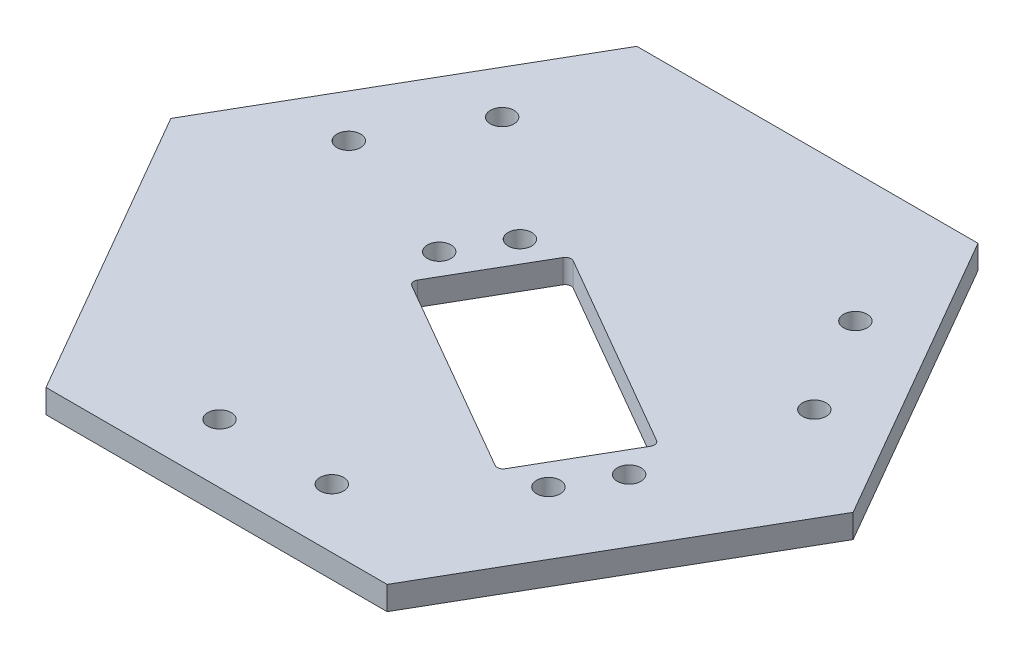
ISO-10303-21;
HEADER;
FILE_DESCRIPTION(('STEP AP214'),'2;1');
FILE_NAME('part.step','',(''),(''),'','','');
FILE_SCHEMA(('AUTOMOTIVE_DESIGN { 1 0 10303 214 1 1 1 1 }'));
ENDSEC;
DATA;
#1=APPLICATION_CONTEXT('core data for automotive mechanical design processes');
#2=APPLICATION_PROTOCOL_DEFINITION('international standard','automotive_design',2000,#1);
#3=PRODUCT_CONTEXT('',#1,'mechanical');
#4=PRODUCT('Part','Part','',(#3));
#5=PRODUCT_RELATED_PRODUCT_CATEGORY('part','',(#4));
#6=PRODUCT_DEFINITION_FORMATION('','',#4);
#7=PRODUCT_DEFINITION_CONTEXT('part definition',#1,'design');
#8=PRODUCT_DEFINITION('design','',#6,#7);
#9=PRODUCT_DEFINITION_SHAPE('','',#8);
#10=(LENGTH_UNIT() NAMED_UNIT(*) SI_UNIT(.MILLI.,.METRE.));
#11=(NAMED_UNIT(*) PLANE_ANGLE_UNIT() SI_UNIT($,.RADIAN.));
#12=(NAMED_UNIT(*) SI_UNIT($,.STERADIAN.) SOLID_ANGLE_UNIT());
#13=UNCERTAINTY_MEASURE_WITH_UNIT(LENGTH_MEASURE(1.E-05),#10,'distance_accuracy_value','');
#14=(GEOMETRIC_REPRESENTATION_CONTEXT(3) GLOBAL_UNCERTAINTY_ASSIGNED_CONTEXT((#13)) GLOBAL_UNIT_ASSIGNED_CONTEXT((#10,
#11,#12)) REPRESENTATION_CONTEXT('',''));
#15=CARTESIAN_POINT('',(0.,0.,0.));
#16=DIRECTION('',(0.,0.,1.));
#17=DIRECTION('',(1.,0.,0.));
#18=AXIS2_PLACEMENT_3D('',#15,#16,#17);
#19=CARTESIAN_POINT('',(-28.8675134594812,2.,50.));
#20=DIRECTION('',(0.,1.,0.));
#21=DIRECTION('',(0.,0.,1.));
#22=AXIS2_PLACEMENT_3D('',#19,#20,#21);
#23=PLANE('',#22);
#24=CARTESIAN_POINT('',(-15.4903810567666,2.,-3.16987298107772));
#25=DIRECTION('',(0.,1.,0.));
#26=DIRECTION('',(0.,0.,-1.));
#27=AXIS2_PLACEMENT_3D('',#24,#25,#26);
#28=CIRCLE('',#27,2.);
#29=CARTESIAN_POINT('',(-15.4903810567666,2.,-5.16987298107772));
#30=VERTEX_POINT('',#29);
#31=EDGE_CURVE('E193',#30,#30,#28,.T.);
#32=ORIENTED_EDGE('',*,*,#31,.F.);
#33=EDGE_LOOP('',(#32));
#34=FACE_BOUND('',#33,.T.);
#35=CARTESIAN_POINT('',(28.2439018343477,2.,22.080127018922));
#36=DIRECTION('',(0.,1.,0.));
#37=DIRECTION('',(0.,0.,-1.));
#38=AXIS2_PLACEMENT_3D('',#35,#36,#37);
#39=CIRCLE('',#38,2.);
#40=CARTESIAN_POINT('',(28.2439018343477,2.,20.080127018922));
#41=VERTEX_POINT('',#40);
#42=EDGE_CURVE('E189',#41,#41,#39,.T.);
#43=ORIENTED_EDGE('',*,*,#42,.F.);
#44=EDGE_LOOP('',(#43));
#45=FACE_BOUND('',#44,.T.);
#46=CARTESIAN_POINT('',(33.2439018343477,2.,13.4198729810776));
#47=DIRECTION('',(0.,1.,0.));
#48=DIRECTION('',(0.,0.,1.));
#49=AXIS2_PLACEMENT_3D('',#46,#47,#48);
#50=CIRCLE('',#49,2.);
#51=CARTESIAN_POINT('',(33.2439018343477,2.,15.4198729810776));
#52=VERTEX_POINT('',#51);
#53=EDGE_CURVE('E185',#52,#52,#50,.T.);
#54=ORIENTED_EDGE('',*,*,#53,.F.);
#55=EDGE_LOOP('',(#54));
#56=FACE_BOUND('',#55,.T.);
#57=CARTESIAN_POINT('',(-10.4903810567667,2.,-11.8301270189221));
#58=DIRECTION('',(0.,1.,0.));
#59=DIRECTION('',(0.,0.,1.));
#60=AXIS2_PLACEMENT_3D('',#57,#58,#59);
#61=CIRCLE('',#60,2.);
#62=CARTESIAN_POINT('',(-10.4903810567667,2.,-9.83012701892213));
#63=VERTEX_POINT('',#62);
#64=EDGE_CURVE('E181',#63,#63,#61,.T.);
#65=ORIENTED_EDGE('',*,*,#64,.F.);
#66=EDGE_LOOP('',(#65));
#67=FACE_BOUND('',#66,.T.);
#68=DIRECTION('',(0.866025403784442,0.,0.499999999999995));
#69=VECTOR('',#68,1.);
#70=CARTESIAN_POINT('',(-13.6602540378444,2.,3.66025403784447));
#71=LINE('',#70,#69);
#72=CARTESIAN_POINT('',(-12.7942286340599,2.,4.16025403784446));
#73=VERTEX_POINT('',#72);
#74=CARTESIAN_POINT('',(20.5477494116411,2.,23.4102540378443));
#75=VERTEX_POINT('',#74);
#76=EDGE_CURVE('E180',#73,#75,#71,.T.);
#77=ORIENTED_EDGE('',*,*,#76,.F.);
#78=CARTESIAN_POINT('',(-12.2942286340599,2.,3.29422863406002));
#79=DIRECTION('',(0.,1.,0.));
#80=DIRECTION('',(0.,0.,1.));
#81=AXIS2_PLACEMENT_3D('',#78,#79,#80);
#82=CIRCLE('',#81,1.);
#83=CARTESIAN_POINT('',(-13.1602540378444,2.,2.79422863406003));
#84=VERTEX_POINT('',#83);
#85=EDGE_CURVE('E216',#73,#84,#82,.F.);
#86=ORIENTED_EDGE('',*,*,#85,.T.);
#87=DIRECTION('',(-0.499999999999995,0.,0.866025403784442));
#88=VECTOR('',#87,1.);
#89=CARTESIAN_POINT('',(-13.6602540378444,2.,3.66025403784447));
#90=LINE('',#89,#88);
#91=CARTESIAN_POINT('',(-4.16025403784446,2.,-12.7942286340599));
#92=VERTEX_POINT('',#91);
#93=EDGE_CURVE('E229',#92,#84,#90,.T.);
#94=ORIENTED_EDGE('',*,*,#93,.F.);
#95=CARTESIAN_POINT('',(-3.29422863406002,2.,-12.2942286340599));
#96=DIRECTION('',(0.,1.,0.));
#97=DIRECTION('',(0.,0.,1.));
#98=AXIS2_PLACEMENT_3D('',#95,#96,#97);
#99=CIRCLE('',#98,1.);
#100=CARTESIAN_POINT('',(-2.79422863406003,2.,-13.1602540378444));
#101=VERTEX_POINT('',#100);
#102=EDGE_CURVE('E42',#92,#101,#99,.F.);
#103=ORIENTED_EDGE('',*,*,#102,.T.);
#104=DIRECTION('',(-0.866025403784442,0.,-0.499999999999995));
#105=VECTOR('',#104,1.);
#106=CARTESIAN_POINT('',(-3.66025403784447,2.,-13.6602540378444));
#107=LINE('',#106,#105);
#108=CARTESIAN_POINT('',(30.547749411641,2.,6.08974596215542));
#109=VERTEX_POINT('',#108);
#110=EDGE_CURVE('E227',#109,#101,#107,.T.);
#111=ORIENTED_EDGE('',*,*,#110,.F.);
#112=CARTESIAN_POINT('',(30.047749411641,2.,6.95577136593986));
#113=DIRECTION('',(0.,1.,0.));
#114=DIRECTION('',(0.,0.,1.));
#115=AXIS2_PLACEMENT_3D('',#112,#113,#114);
#116=CIRCLE('',#115,1.);
#117=CARTESIAN_POINT('',(30.9137748154254,2.,7.45577136593986));
#118=VERTEX_POINT('',#117);
#119=EDGE_CURVE('E220',#109,#118,#116,.F.);
#120=ORIENTED_EDGE('',*,*,#119,.T.);
#121=DIRECTION('',(0.499999999999995,0.,-0.866025403784441));
#122=VECTOR('',#121,1.);
#123=CARTESIAN_POINT('',(21.4137748154255,2.,23.9102540378443));
#124=LINE('',#123,#122);
#125=CARTESIAN_POINT('',(21.9137748154255,2.,23.0442286340598));
#126=VERTEX_POINT('',#125);
#127=EDGE_CURVE('E234',#126,#118,#124,.T.);
#128=ORIENTED_EDGE('',*,*,#127,.F.);
#129=CARTESIAN_POINT('',(21.0477494116411,2.,22.5442286340598));
#130=DIRECTION('',(0.,1.,0.));
#131=DIRECTION('',(0.,0.,1.));
#132=AXIS2_PLACEMENT_3D('',#129,#130,#131);
#133=CIRCLE('',#132,1.);
#134=EDGE_CURVE('E212',#126,#75,#133,.F.);
#135=ORIENTED_EDGE('',*,*,#134,.T.);
#136=EDGE_LOOP('',(#77,#86,#94,#103,#111,#120,#128,#135));
#137=FACE_BOUND('',#136,.T.);
#138=CARTESIAN_POINT('',(-39.3910161513776,2.,-11.7727586640479));
#139=DIRECTION('',(0.,1.,0.));
#140=DIRECTION('',(0.,0.,-1.));
#141=AXIS2_PLACEMENT_3D('',#138,#139,#140);
#142=CIRCLE('',#141,2.);
#143=CARTESIAN_POINT('',(-39.3910161513776,2.,-13.7727586640479));
#144=VERTEX_POINT('',#143);
#145=EDGE_CURVE('E276',#144,#144,#142,.T.);
#146=ORIENTED_EDGE('',*,*,#145,.F.);
#147=EDGE_LOOP('',(#146));
#148=FACE_BOUND('',#147,.T.);
#149=CARTESIAN_POINT('',(-9.49999999999999,2.,40.));
#150=DIRECTION('',(0.,1.,0.));
#151=DIRECTION('',(0.,0.,1.));
#152=AXIS2_PLACEMENT_3D('',#149,#150,#151);
#153=CIRCLE('',#152,2.);
#154=CARTESIAN_POINT('',(-9.49999999999999,2.,42.));
#155=VERTEX_POINT('',#154);
#156=EDGE_CURVE('E288',#155,#155,#153,.T.);
#157=ORIENTED_EDGE('',*,*,#156,.F.);
#158=EDGE_LOOP('',(#157));
#159=FACE_BOUND('',#158,.T.);
#160=CARTESIAN_POINT('',(29.8910161513776,2.,-28.2272413359522));
#161=DIRECTION('',(0.,1.,0.));
#162=DIRECTION('',(0.,0.,1.));
#163=AXIS2_PLACEMENT_3D('',#160,#161,#162);
#164=CIRCLE('',#163,2.);
#165=CARTESIAN_POINT('',(29.8910161513776,2.,-26.2272413359522));
#166=VERTEX_POINT('',#165);
#167=EDGE_CURVE('E300',#166,#166,#164,.T.);
#168=ORIENTED_EDGE('',*,*,#167,.F.);
#169=EDGE_LOOP('',(#168));
#170=FACE_BOUND('',#169,.T.);
#171=DIRECTION('',(0.500000000000002,0.,0.866025403784438));
#172=VECTOR('',#171,1.);
#173=CARTESIAN_POINT('',(-57.7350269189626,2.,0.));
#174=LINE('',#173,#172);
#175=CARTESIAN_POINT('',(-57.7350269189626,2.,0.));
#176=VERTEX_POINT('',#175);
#177=CARTESIAN_POINT('',(-28.8675134594812,2.,50.));
#178=VERTEX_POINT('',#177);
#179=EDGE_CURVE('E147',#176,#178,#174,.T.);
#180=ORIENTED_EDGE('',*,*,#179,.T.);
#181=DIRECTION('',(1.,0.,0.));
#182=VECTOR('',#181,1.);
#183=CARTESIAN_POINT('',(-28.8675134594812,2.,50.));
#184=LINE('',#183,#182);
#185=CARTESIAN_POINT('',(28.8675134594813,2.,50.));
#186=VERTEX_POINT('',#185);
#187=EDGE_CURVE('E136',#178,#186,#184,.T.);
#188=ORIENTED_EDGE('',*,*,#187,.T.);
#189=DIRECTION('',(0.5,0.,-0.866025403784438));
#190=VECTOR('',#189,1.);
#191=CARTESIAN_POINT('',(28.8675134594813,2.,50.));
#192=LINE('',#191,#190);
#193=CARTESIAN_POINT('',(57.7350269189626,2.,0.));
#194=VERTEX_POINT('',#193);
#195=EDGE_CURVE('E146',#186,#194,#192,.T.);
#196=ORIENTED_EDGE('',*,*,#195,.T.);
#197=DIRECTION('',(-0.5,0.,-0.866025403784438));
#198=VECTOR('',#197,1.);
#199=CARTESIAN_POINT('',(57.7350269189626,2.,0.));
#200=LINE('',#199,#198);
#201=CARTESIAN_POINT('',(28.8675134594813,2.,-50.));
#202=VERTEX_POINT('',#201);
#203=EDGE_CURVE('E306',#194,#202,#200,.T.);
#204=ORIENTED_EDGE('',*,*,#203,.T.);
#205=DIRECTION('',(-1.,0.,0.));
#206=VECTOR('',#205,1.);
#207=CARTESIAN_POINT('',(-28.8675134594813,2.,-50.));
#208=LINE('',#207,#206);
#209=CARTESIAN_POINT('',(-28.8675134594813,2.,-50.));
#210=VERTEX_POINT('',#209);
#211=EDGE_CURVE('E308',#202,#210,#208,.T.);
#212=ORIENTED_EDGE('',*,*,#211,.T.);
#213=DIRECTION('',(-0.5,0.,0.866025403784439));
#214=VECTOR('',#213,1.);
#215=CARTESIAN_POINT('',(-28.8675134594813,2.,-50.));
#216=LINE('',#215,#214);
#217=EDGE_CURVE('E152',#210,#176,#216,.T.);
#218=ORIENTED_EDGE('',*,*,#217,.T.);
#219=EDGE_LOOP('',(#180,#188,#196,#204,#212,#218));
#220=FACE_BOUND('',#219,.T.);
#221=CARTESIAN_POINT('',(39.3910161513776,2.,-11.7727586640479));
#222=DIRECTION('',(0.,1.,0.));
#223=DIRECTION('',(0.,0.,1.));
#224=AXIS2_PLACEMENT_3D('',#221,#222,#223);
#225=CIRCLE('',#224,2.);
#226=CARTESIAN_POINT('',(39.3910161513776,2.,-9.77275866404785));
#227=VERTEX_POINT('',#226);
#228=EDGE_CURVE('E294',#227,#227,#225,.T.);
#229=ORIENTED_EDGE('',*,*,#228,.F.);
#230=EDGE_LOOP('',(#229));
#231=FACE_BOUND('',#230,.T.);
#232=CARTESIAN_POINT('',(9.50000000000001,2.,40.));
#233=DIRECTION('',(0.,1.,0.));
#234=DIRECTION('',(0.,0.,1.));
#235=AXIS2_PLACEMENT_3D('',#232,#233,#234);
#236=CIRCLE('',#235,2.);
#237=CARTESIAN_POINT('',(9.50000000000001,2.,42.));
#238=VERTEX_POINT('',#237);
#239=EDGE_CURVE('E282',#238,#238,#236,.T.);
#240=ORIENTED_EDGE('',*,*,#239,.F.);
#241=EDGE_LOOP('',(#240));
#242=FACE_BOUND('',#241,.T.);
#243=CARTESIAN_POINT('',(-29.8910161513776,2.,-28.2272413359522));
#244=DIRECTION('',(0.,1.,0.));
#245=DIRECTION('',(0.,0.,-1.));
#246=AXIS2_PLACEMENT_3D('',#243,#244,#245);
#247=CIRCLE('',#246,2.);
#248=CARTESIAN_POINT('',(-29.8910161513776,2.,-30.2272413359522));
#249=VERTEX_POINT('',#248);
#250=EDGE_CURVE('E270',#249,#249,#247,.T.);
#251=ORIENTED_EDGE('',*,*,#250,.F.);
#252=EDGE_LOOP('',(#251));
#253=FACE_BOUND('',#252,.T.);
#254=ADVANCED_FACE('F34',(#34,#45,#56,#67,#137,#148,#159,#170,#220,#231,#242,#253),#23,.T.);
#255=CARTESIAN_POINT('',(-28.8675134594812,-2.,50.));
#256=DIRECTION('',(0.,1.,0.));
#257=DIRECTION('',(0.,0.,1.));
#258=AXIS2_PLACEMENT_3D('',#255,#256,#257);
#259=PLANE('',#258);
#260=CARTESIAN_POINT('',(-15.4903810567666,-2.,-3.16987298107772));
#261=DIRECTION('',(0.,1.,0.));
#262=DIRECTION('',(0.,0.,1.));
#263=AXIS2_PLACEMENT_3D('',#260,#261,#262);
#264=CIRCLE('',#263,2.);
#265=CARTESIAN_POINT('',(-15.4903810567666,-2.,-1.16987298107771));
#266=VERTEX_POINT('',#265);
#267=EDGE_CURVE('E190',#266,#266,#264,.T.);
#268=ORIENTED_EDGE('',*,*,#267,.T.);
#269=EDGE_LOOP('',(#268));
#270=FACE_BOUND('',#269,.T.);
#271=CARTESIAN_POINT('',(28.2439018343477,-2.,22.080127018922));
#272=DIRECTION('',(0.,1.,0.));
#273=DIRECTION('',(0.,0.,1.));
#274=AXIS2_PLACEMENT_3D('',#271,#272,#273);
#275=CIRCLE('',#274,2.);
#276=CARTESIAN_POINT('',(28.2439018343477,-2.,24.080127018922));
#277=VERTEX_POINT('',#276);
#278=EDGE_CURVE('E186',#277,#277,#275,.T.);
#279=ORIENTED_EDGE('',*,*,#278,.T.);
#280=EDGE_LOOP('',(#279));
#281=FACE_BOUND('',#280,.T.);
#282=CARTESIAN_POINT('',(33.2439018343477,-2.,13.4198729810776));
#283=DIRECTION('',(0.,1.,0.));
#284=DIRECTION('',(0.,0.,1.));
#285=AXIS2_PLACEMENT_3D('',#282,#283,#284);
#286=CIRCLE('',#285,2.);
#287=CARTESIAN_POINT('',(33.2439018343477,-2.,15.4198729810776));
#288=VERTEX_POINT('',#287);
#289=EDGE_CURVE('E182',#288,#288,#286,.T.);
#290=ORIENTED_EDGE('',*,*,#289,.T.);
#291=EDGE_LOOP('',(#290));
#292=FACE_BOUND('',#291,.T.);
#293=CARTESIAN_POINT('',(-10.4903810567667,-2.,-11.8301270189221));
#294=DIRECTION('',(0.,1.,0.));
#295=DIRECTION('',(0.,0.,1.));
#296=AXIS2_PLACEMENT_3D('',#293,#294,#295);
#297=CIRCLE('',#296,2.);
#298=CARTESIAN_POINT('',(-10.4903810567667,-2.,-9.83012701892213));
#299=VERTEX_POINT('',#298);
#300=EDGE_CURVE('E177',#299,#299,#297,.T.);
#301=ORIENTED_EDGE('',*,*,#300,.T.);
#302=EDGE_LOOP('',(#301));
#303=FACE_BOUND('',#302,.T.);
#304=DIRECTION('',(-0.866025403784442,0.,-0.499999999999995));
#305=VECTOR('',#304,1.);
#306=CARTESIAN_POINT('',(4.9999999999997,-2.,-8.66025403784457));
#307=LINE('',#306,#305);
#308=CARTESIAN_POINT('',(30.547749411641,-2.,6.08974596215542));
#309=VERTEX_POINT('',#308);
#310=CARTESIAN_POINT('',(-2.79422863406003,-2.,-13.1602540378444));
#311=VERTEX_POINT('',#310);
#312=EDGE_CURVE('E163',#309,#311,#307,.T.);
#313=ORIENTED_EDGE('',*,*,#312,.T.);
#314=CARTESIAN_POINT('',(-3.29422863406002,-2.,-12.2942286340599));
#315=DIRECTION('',(0.,1.,0.));
#316=DIRECTION('',(0.,0.,1.));
#317=AXIS2_PLACEMENT_3D('',#314,#315,#316);
#318=CIRCLE('',#317,1.);
#319=CARTESIAN_POINT('',(-4.16025403784446,-2.,-12.7942286340599));
#320=VERTEX_POINT('',#319);
#321=EDGE_CURVE('E11',#311,#320,#318,.T.);
#322=ORIENTED_EDGE('',*,*,#321,.T.);
#323=DIRECTION('',(-0.499999999999995,0.,0.866025403784442));
#324=VECTOR('',#323,1.);
#325=CARTESIAN_POINT('',(-37.5277674973254,-2.,45.0000000000002));
#326=LINE('',#325,#324);
#327=CARTESIAN_POINT('',(-13.1602540378444,-2.,2.79422863406002));
#328=VERTEX_POINT('',#327);
#329=EDGE_CURVE('E170',#320,#328,#326,.T.);
#330=ORIENTED_EDGE('',*,*,#329,.T.);
#331=CARTESIAN_POINT('',(-12.2942286340599,-2.,3.29422863406002));
#332=DIRECTION('',(0.,1.,0.));
#333=DIRECTION('',(0.,0.,1.));
#334=AXIS2_PLACEMENT_3D('',#331,#332,#333);
#335=CIRCLE('',#334,1.);
#336=CARTESIAN_POINT('',(-12.7942286340599,-2.,4.16025403784446));
#337=VERTEX_POINT('',#336);
#338=EDGE_CURVE('E218',#328,#337,#335,.T.);
#339=ORIENTED_EDGE('',*,*,#338,.T.);
#340=DIRECTION('',(0.866025403784442,0.,0.499999999999995));
#341=VECTOR('',#340,1.);
#342=CARTESIAN_POINT('',(-5.00000000000018,-2.,8.66025403784428));
#343=LINE('',#342,#341);
#344=CARTESIAN_POINT('',(20.5477494116411,-2.,23.4102540378443));
#345=VERTEX_POINT('',#344);
#346=EDGE_CURVE('E173',#337,#345,#343,.T.);
#347=ORIENTED_EDGE('',*,*,#346,.T.);
#348=CARTESIAN_POINT('',(21.0477494116411,-2.,22.5442286340598));
#349=DIRECTION('',(0.,1.,0.));
#350=DIRECTION('',(0.,0.,1.));
#351=AXIS2_PLACEMENT_3D('',#348,#349,#350);
#352=CIRCLE('',#351,1.);
#353=CARTESIAN_POINT('',(21.9137748154255,-2.,23.0442286340598));
#354=VERTEX_POINT('',#353);
#355=EDGE_CURVE('E214',#345,#354,#352,.T.);
#356=ORIENTED_EDGE('',*,*,#355,.T.);
#357=DIRECTION('',(0.499999999999995,0.,-0.866025403784442));
#358=VECTOR('',#357,1.);
#359=CARTESIAN_POINT('',(-2.45373864405551,-2.,65.25));
#360=LINE('',#359,#358);
#361=CARTESIAN_POINT('',(30.9137748154254,-2.,7.45577136593985));
#362=VERTEX_POINT('',#361);
#363=EDGE_CURVE('E161',#354,#362,#360,.T.);
#364=ORIENTED_EDGE('',*,*,#363,.T.);
#365=CARTESIAN_POINT('',(30.047749411641,-2.,6.95577136593986));
#366=DIRECTION('',(0.,1.,0.));
#367=DIRECTION('',(0.,0.,1.));
#368=AXIS2_PLACEMENT_3D('',#365,#366,#367);
#369=CIRCLE('',#368,1.);
#370=EDGE_CURVE('E56',#362,#309,#369,.T.);
#371=ORIENTED_EDGE('',*,*,#370,.T.);
#372=EDGE_LOOP('',(#313,#322,#330,#339,#347,#356,#364,#371));
#373=FACE_BOUND('',#372,.T.);
#374=CARTESIAN_POINT('',(-39.3910161513776,-2.,-11.7727586640479));
#375=DIRECTION('',(0.,1.,0.));
#376=DIRECTION('',(0.,0.,-1.));
#377=AXIS2_PLACEMENT_3D('',#374,#375,#376);
#378=CIRCLE('',#377,2.);
#379=CARTESIAN_POINT('',(-39.3910161513776,-2.,-13.7727586640479));
#380=VERTEX_POINT('',#379);
#381=EDGE_CURVE('E273',#380,#380,#378,.T.);
#382=ORIENTED_EDGE('',*,*,#381,.T.);
#383=EDGE_LOOP('',(#382));
#384=FACE_BOUND('',#383,.T.);
#385=CARTESIAN_POINT('',(-9.49999999999999,-2.,40.));
#386=DIRECTION('',(0.,1.,0.));
#387=DIRECTION('',(0.,0.,1.));
#388=AXIS2_PLACEMENT_3D('',#385,#386,#387);
#389=CIRCLE('',#388,2.);
#390=CARTESIAN_POINT('',(-9.49999999999999,-2.,42.));
#391=VERTEX_POINT('',#390);
#392=EDGE_CURVE('E285',#391,#391,#389,.T.);
#393=ORIENTED_EDGE('',*,*,#392,.T.);
#394=EDGE_LOOP('',(#393));
#395=FACE_BOUND('',#394,.T.);
#396=CARTESIAN_POINT('',(29.8910161513776,-2.,-28.2272413359522));
#397=DIRECTION('',(0.,1.,0.));
#398=DIRECTION('',(0.,0.,1.));
#399=AXIS2_PLACEMENT_3D('',#396,#397,#398);
#400=CIRCLE('',#399,2.);
#401=CARTESIAN_POINT('',(29.8910161513776,-2.,-26.2272413359522));
#402=VERTEX_POINT('',#401);
#403=EDGE_CURVE('E297',#402,#402,#400,.T.);
#404=ORIENTED_EDGE('',*,*,#403,.T.);
#405=EDGE_LOOP('',(#404));
#406=FACE_BOUND('',#405,.T.);
#407=DIRECTION('',(0.500000000000002,0.,0.866025403784438));
#408=VECTOR('',#407,1.);
#409=CARTESIAN_POINT('',(-57.7350269189626,-2.,0.));
#410=LINE('',#409,#408);
#411=CARTESIAN_POINT('',(-57.7350269189626,-2.,0.));
#412=VERTEX_POINT('',#411);
#413=CARTESIAN_POINT('',(-28.8675134594812,-2.,50.));
#414=VERTEX_POINT('',#413);
#415=EDGE_CURVE('E160',#412,#414,#410,.T.);
#416=ORIENTED_EDGE('',*,*,#415,.F.);
#417=DIRECTION('',(-0.5,0.,0.866025403784439));
#418=VECTOR('',#417,1.);
#419=CARTESIAN_POINT('',(-28.8675134594813,-2.,-50.));
#420=LINE('',#419,#418);
#421=CARTESIAN_POINT('',(-28.8675134594813,-2.,-50.));
#422=VERTEX_POINT('',#421);
#423=EDGE_CURVE('E156',#422,#412,#420,.T.);
#424=ORIENTED_EDGE('',*,*,#423,.F.);
#425=DIRECTION('',(-1.,0.,0.));
#426=VECTOR('',#425,1.);
#427=CARTESIAN_POINT('',(-28.8675134594813,-2.,-50.));
#428=LINE('',#427,#426);
#429=CARTESIAN_POINT('',(28.8675134594813,-2.,-50.));
#430=VERTEX_POINT('',#429);
#431=EDGE_CURVE('E319',#430,#422,#428,.T.);
#432=ORIENTED_EDGE('',*,*,#431,.F.);
#433=DIRECTION('',(-0.5,0.,-0.866025403784438));
#434=VECTOR('',#433,1.);
#435=CARTESIAN_POINT('',(57.7350269189626,-2.,0.));
#436=LINE('',#435,#434);
#437=CARTESIAN_POINT('',(57.7350269189626,-2.,0.));
#438=VERTEX_POINT('',#437);
#439=EDGE_CURVE('E317',#438,#430,#436,.T.);
#440=ORIENTED_EDGE('',*,*,#439,.F.);
#441=DIRECTION('',(0.5,0.,-0.866025403784438));
#442=VECTOR('',#441,1.);
#443=CARTESIAN_POINT('',(28.8675134594813,-2.,50.));
#444=LINE('',#443,#442);
#445=CARTESIAN_POINT('',(28.8675134594813,-2.,50.));
#446=VERTEX_POINT('',#445);
#447=EDGE_CURVE('E315',#446,#438,#444,.T.);
#448=ORIENTED_EDGE('',*,*,#447,.F.);
#449=DIRECTION('',(1.,0.,0.));
#450=VECTOR('',#449,1.);
#451=CARTESIAN_POINT('',(-28.8675134594812,-2.,50.));
#452=LINE('',#451,#450);
#453=EDGE_CURVE('E313',#414,#446,#452,.T.);
#454=ORIENTED_EDGE('',*,*,#453,.F.);
#455=EDGE_LOOP('',(#416,#424,#432,#440,#448,#454));
#456=FACE_BOUND('',#455,.T.);
#457=CARTESIAN_POINT('',(39.3910161513776,-2.,-11.7727586640479));
#458=DIRECTION('',(0.,1.,0.));
#459=DIRECTION('',(0.,0.,1.));
#460=AXIS2_PLACEMENT_3D('',#457,#458,#459);
#461=CIRCLE('',#460,2.);
#462=CARTESIAN_POINT('',(39.3910161513776,-2.,-9.77275866404785));
#463=VERTEX_POINT('',#462);
#464=EDGE_CURVE('E291',#463,#463,#461,.T.);
#465=ORIENTED_EDGE('',*,*,#464,.T.);
#466=EDGE_LOOP('',(#465));
#467=FACE_BOUND('',#466,.T.);
#468=CARTESIAN_POINT('',(9.50000000000001,-2.,40.));
#469=DIRECTION('',(0.,1.,0.));
#470=DIRECTION('',(0.,0.,1.));
#471=AXIS2_PLACEMENT_3D('',#468,#469,#470);
#472=CIRCLE('',#471,2.);
#473=CARTESIAN_POINT('',(9.50000000000001,-2.,42.));
#474=VERTEX_POINT('',#473);
#475=EDGE_CURVE('E279',#474,#474,#472,.T.);
#476=ORIENTED_EDGE('',*,*,#475,.T.);
#477=EDGE_LOOP('',(#476));
#478=FACE_BOUND('',#477,.T.);
#479=CARTESIAN_POINT('',(-29.8910161513776,-2.,-28.2272413359522));
#480=DIRECTION('',(0.,1.,0.));
#481=DIRECTION('',(0.,0.,-1.));
#482=AXIS2_PLACEMENT_3D('',#479,#480,#481);
#483=CIRCLE('',#482,2.);
#484=CARTESIAN_POINT('',(-29.8910161513776,-2.,-30.2272413359522));
#485=VERTEX_POINT('',#484);
#486=EDGE_CURVE('E269',#485,#485,#483,.T.);
#487=ORIENTED_EDGE('',*,*,#486,.T.);
#488=EDGE_LOOP('',(#487));
#489=FACE_BOUND('',#488,.T.);
#490=ADVANCED_FACE('F238',(#270,#281,#292,#303,#373,#384,#395,#406,#456,#467,#478,#489),#259,.F.);
#491=CARTESIAN_POINT('',(-57.7350269189626,2.,0.));
#492=DIRECTION('',(0.866025403784438,0.,-0.500000000000002));
#493=DIRECTION('',(-0.500000000000002,0.,-0.866025403784438));
#494=AXIS2_PLACEMENT_3D('',#491,#492,#493);
#495=PLANE('',#494);
#496=ORIENTED_EDGE('',*,*,#415,.T.);
#497=DIRECTION('',(0.,-1.,0.));
#498=VECTOR('',#497,1.);
#499=CARTESIAN_POINT('',(-28.8675134594812,2.,50.));
#500=LINE('',#499,#498);
#501=EDGE_CURVE('E140',#178,#414,#500,.T.);
#502=ORIENTED_EDGE('',*,*,#501,.F.);
#503=ORIENTED_EDGE('',*,*,#179,.F.);
#504=DIRECTION('',(0.,-1.,0.));
#505=VECTOR('',#504,1.);
#506=CARTESIAN_POINT('',(-57.7350269189626,2.,0.));
#507=LINE('',#506,#505);
#508=EDGE_CURVE('E311',#176,#412,#507,.T.);
#509=ORIENTED_EDGE('',*,*,#508,.T.);
#510=EDGE_LOOP('',(#496,#502,#503,#509));
#511=FACE_BOUND('',#510,.T.);
#512=ADVANCED_FACE('F158',(#511),#495,.F.);
#513=CARTESIAN_POINT('',(-28.8675134594812,2.,50.));
#514=DIRECTION('',(0.,0.,-1.));
#515=DIRECTION('',(-1.,0.,0.));
#516=AXIS2_PLACEMENT_3D('',#513,#514,#515);
#517=PLANE('',#516);
#518=ORIENTED_EDGE('',*,*,#453,.T.);
#519=DIRECTION('',(0.,-1.,0.));
#520=VECTOR('',#519,1.);
#521=CARTESIAN_POINT('',(28.8675134594813,2.,50.));
#522=LINE('',#521,#520);
#523=EDGE_CURVE('E143',#186,#446,#522,.T.);
#524=ORIENTED_EDGE('',*,*,#523,.F.);
#525=ORIENTED_EDGE('',*,*,#187,.F.);
#526=ORIENTED_EDGE('',*,*,#501,.T.);
#527=EDGE_LOOP('',(#518,#524,#525,#526));
#528=FACE_BOUND('',#527,.T.);
#529=ADVANCED_FACE('F138',(#528),#517,.F.);
#530=CARTESIAN_POINT('',(28.8675134594813,2.,50.));
#531=DIRECTION('',(-0.866025403784439,0.,-0.5));
#532=DIRECTION('',(-0.5,0.,0.866025403784439));
#533=AXIS2_PLACEMENT_3D('',#530,#531,#532);
#534=PLANE('',#533);
#535=ORIENTED_EDGE('',*,*,#447,.T.);
#536=DIRECTION('',(0.,-1.,0.));
#537=VECTOR('',#536,1.);
#538=CARTESIAN_POINT('',(57.7350269189626,2.,0.));
#539=LINE('',#538,#537);
#540=EDGE_CURVE('E165',#194,#438,#539,.T.);
#541=ORIENTED_EDGE('',*,*,#540,.F.);
#542=ORIENTED_EDGE('',*,*,#195,.F.);
#543=ORIENTED_EDGE('',*,*,#523,.T.);
#544=EDGE_LOOP('',(#535,#541,#542,#543));
#545=FACE_BOUND('',#544,.T.);
#546=ADVANCED_FACE('F347',(#545),#534,.F.);
#547=CARTESIAN_POINT('',(57.7350269189626,2.,0.));
#548=DIRECTION('',(-0.866025403784439,0.,0.5));
#549=DIRECTION('',(0.5,0.,0.866025403784438));
#550=AXIS2_PLACEMENT_3D('',#547,#548,#549);
#551=PLANE('',#550);
#552=ORIENTED_EDGE('',*,*,#439,.T.);
#553=DIRECTION('',(0.,-1.,0.));
#554=VECTOR('',#553,1.);
#555=CARTESIAN_POINT('',(28.8675134594813,2.,-50.));
#556=LINE('',#555,#554);
#557=EDGE_CURVE('E326',#202,#430,#556,.T.);
#558=ORIENTED_EDGE('',*,*,#557,.F.);
#559=ORIENTED_EDGE('',*,*,#203,.F.);
#560=ORIENTED_EDGE('',*,*,#540,.T.);
#561=EDGE_LOOP('',(#552,#558,#559,#560));
#562=FACE_BOUND('',#561,.T.);
#563=ADVANCED_FACE('F333',(#562),#551,.F.);
#564=CARTESIAN_POINT('',(-28.8675134594813,2.,-50.));
#565=DIRECTION('',(0.,0.,1.));
#566=DIRECTION('',(1.,0.,0.));
#567=AXIS2_PLACEMENT_3D('',#564,#565,#566);
#568=PLANE('',#567);
#569=ORIENTED_EDGE('',*,*,#431,.T.);
#570=DIRECTION('',(0.,-1.,0.));
#571=VECTOR('',#570,1.);
#572=CARTESIAN_POINT('',(-28.8675134594813,2.,-50.));
#573=LINE('',#572,#571);
#574=EDGE_CURVE('E323',#210,#422,#573,.T.);
#575=ORIENTED_EDGE('',*,*,#574,.F.);
#576=ORIENTED_EDGE('',*,*,#211,.F.);
#577=ORIENTED_EDGE('',*,*,#557,.T.);
#578=EDGE_LOOP('',(#569,#575,#576,#577));
#579=FACE_BOUND('',#578,.T.);
#580=ADVANCED_FACE('F343',(#579),#568,.F.);
#581=CARTESIAN_POINT('',(-28.8675134594813,2.,-50.));
#582=DIRECTION('',(0.866025403784439,0.,0.5));
#583=DIRECTION('',(0.5,0.,-0.866025403784439));
#584=AXIS2_PLACEMENT_3D('',#581,#582,#583);
#585=PLANE('',#584);
#586=ORIENTED_EDGE('',*,*,#423,.T.);
#587=ORIENTED_EDGE('',*,*,#508,.F.);
#588=ORIENTED_EDGE('',*,*,#217,.F.);
#589=ORIENTED_EDGE('',*,*,#574,.T.);
#590=EDGE_LOOP('',(#586,#587,#588,#589));
#591=FACE_BOUND('',#590,.T.);
#592=ADVANCED_FACE('F346',(#591),#585,.F.);
#593=CARTESIAN_POINT('',(29.8910161513776,2.,-28.2272413359522));
#594=DIRECTION('',(0.,-1.,0.));
#595=DIRECTION('',(0.,0.,-1.));
#596=AXIS2_PLACEMENT_3D('',#593,#594,#595);
#597=CYLINDRICAL_SURFACE('',#596,2.);
#598=ORIENTED_EDGE('',*,*,#167,.T.);
#599=EDGE_LOOP('',(#598));
#600=FACE_BOUND('',#599,.T.);
#601=ORIENTED_EDGE('',*,*,#403,.F.);
#602=EDGE_LOOP('',(#601));
#603=FACE_BOUND('',#602,.T.);
#604=ADVANCED_FACE('F367',(#600,#603),#597,.F.);
#605=CARTESIAN_POINT('',(39.3910161513776,2.,-11.7727586640479));
#606=DIRECTION('',(0.,-1.,0.));
#607=DIRECTION('',(0.,0.,-1.));
#608=AXIS2_PLACEMENT_3D('',#605,#606,#607);
#609=CYLINDRICAL_SURFACE('',#608,2.);
#610=ORIENTED_EDGE('',*,*,#228,.T.);
#611=EDGE_LOOP('',(#610));
#612=FACE_BOUND('',#611,.T.);
#613=ORIENTED_EDGE('',*,*,#464,.F.);
#614=EDGE_LOOP('',(#613));
#615=FACE_BOUND('',#614,.T.);
#616=ADVANCED_FACE('F387',(#612,#615),#609,.F.);
#617=CARTESIAN_POINT('',(-9.49999999999999,2.,40.));
#618=DIRECTION('',(0.,-1.,0.));
#619=DIRECTION('',(0.,0.,-1.));
#620=AXIS2_PLACEMENT_3D('',#617,#618,#619);
#621=CYLINDRICAL_SURFACE('',#620,2.);
#622=ORIENTED_EDGE('',*,*,#156,.T.);
#623=EDGE_LOOP('',(#622));
#624=FACE_BOUND('',#623,.T.);
#625=ORIENTED_EDGE('',*,*,#392,.F.);
#626=EDGE_LOOP('',(#625));
#627=FACE_BOUND('',#626,.T.);
#628=ADVANCED_FACE('F394',(#624,#627),#621,.F.);
#629=CARTESIAN_POINT('',(9.50000000000001,2.,40.));
#630=DIRECTION('',(0.,-1.,0.));
#631=DIRECTION('',(0.,0.,-1.));
#632=AXIS2_PLACEMENT_3D('',#629,#630,#631);
#633=CYLINDRICAL_SURFACE('',#632,2.);
#634=ORIENTED_EDGE('',*,*,#239,.T.);
#635=EDGE_LOOP('',(#634));
#636=FACE_BOUND('',#635,.T.);
#637=ORIENTED_EDGE('',*,*,#475,.F.);
#638=EDGE_LOOP('',(#637));
#639=FACE_BOUND('',#638,.T.);
#640=ADVANCED_FACE('F401',(#636,#639),#633,.F.);
#641=CARTESIAN_POINT('',(-39.3910161513776,2.,-11.7727586640479));
#642=DIRECTION('',(0.,-1.,0.));
#643=DIRECTION('',(0.,0.,-1.));
#644=AXIS2_PLACEMENT_3D('',#641,#642,#643);
#645=CYLINDRICAL_SURFACE('',#644,2.);
#646=ORIENTED_EDGE('',*,*,#145,.T.);
#647=EDGE_LOOP('',(#646));
#648=FACE_BOUND('',#647,.T.);
#649=ORIENTED_EDGE('',*,*,#381,.F.);
#650=EDGE_LOOP('',(#649));
#651=FACE_BOUND('',#650,.T.);
#652=ADVANCED_FACE('F409',(#648,#651),#645,.F.);
#653=CARTESIAN_POINT('',(-29.8910161513776,2.,-28.2272413359522));
#654=DIRECTION('',(0.,-1.,0.));
#655=DIRECTION('',(0.,0.,-1.));
#656=AXIS2_PLACEMENT_3D('',#653,#654,#655);
#657=CYLINDRICAL_SURFACE('',#656,2.);
#658=ORIENTED_EDGE('',*,*,#250,.T.);
#659=EDGE_LOOP('',(#658));
#660=FACE_BOUND('',#659,.T.);
#661=ORIENTED_EDGE('',*,*,#486,.F.);
#662=EDGE_LOOP('',(#661));
#663=FACE_BOUND('',#662,.T.);
#664=ADVANCED_FACE('F417',(#660,#663),#657,.F.);
#665=CARTESIAN_POINT('',(-13.6602540378444,-8.,3.66025403784447));
#666=DIRECTION('',(-0.499999999999995,0.,0.866025403784442));
#667=DIRECTION('',(0.866025403784442,0.,0.499999999999995));
#668=AXIS2_PLACEMENT_3D('',#665,#666,#667);
#669=PLANE('',#668);
#670=ORIENTED_EDGE('',*,*,#76,.T.);
#671=DIRECTION('',(0.,1.,0.));
#672=VECTOR('',#671,1.);
#673=CARTESIAN_POINT('',(20.5477494116411,-2.,23.4102540378443));
#674=LINE('',#673,#672);
#675=EDGE_CURVE('E201',#75,#345,#674,.F.);
#676=ORIENTED_EDGE('',*,*,#675,.T.);
#677=ORIENTED_EDGE('',*,*,#346,.F.);
#678=DIRECTION('',(0.,1.,0.));
#679=VECTOR('',#678,1.);
#680=CARTESIAN_POINT('',(-12.7942286340599,2.,4.16025403784446));
#681=LINE('',#680,#679);
#682=EDGE_CURVE('E198',#337,#73,#681,.T.);
#683=ORIENTED_EDGE('',*,*,#682,.T.);
#684=EDGE_LOOP('',(#670,#676,#677,#683));
#685=FACE_BOUND('',#684,.T.);
#686=ADVANCED_FACE('F251',(#685),#669,.F.);
#687=CARTESIAN_POINT('',(-13.6602540378444,-8.,3.66025403784447));
#688=DIRECTION('',(-0.866025403784442,0.,-0.499999999999995));
#689=DIRECTION('',(-0.499999999999995,0.,0.866025403784442));
#690=AXIS2_PLACEMENT_3D('',#687,#688,#689);
#691=PLANE('',#690);
#692=ORIENTED_EDGE('',*,*,#93,.T.);
#693=DIRECTION('',(0.,1.,0.));
#694=VECTOR('',#693,1.);
#695=CARTESIAN_POINT('',(-13.1602540378444,-2.,2.79422863406003));
#696=LINE('',#695,#694);
#697=EDGE_CURVE('E206',#84,#328,#696,.F.);
#698=ORIENTED_EDGE('',*,*,#697,.T.);
#699=ORIENTED_EDGE('',*,*,#329,.F.);
#700=DIRECTION('',(0.,1.,0.));
#701=VECTOR('',#700,1.);
#702=CARTESIAN_POINT('',(-4.16025403784446,2.,-12.7942286340599));
#703=LINE('',#702,#701);
#704=EDGE_CURVE('E203',#320,#92,#703,.T.);
#705=ORIENTED_EDGE('',*,*,#704,.T.);
#706=EDGE_LOOP('',(#692,#698,#699,#705));
#707=FACE_BOUND('',#706,.T.);
#708=ADVANCED_FACE('F242',(#707),#691,.F.);
#709=CARTESIAN_POINT('',(-3.66025403784447,-8.,-13.6602540378444));
#710=DIRECTION('',(0.499999999999995,0.,-0.866025403784442));
#711=DIRECTION('',(-0.866025403784442,0.,-0.499999999999995));
#712=AXIS2_PLACEMENT_3D('',#709,#710,#711);
#713=PLANE('',#712);
#714=ORIENTED_EDGE('',*,*,#312,.F.);
#715=DIRECTION('',(0.,1.,0.));
#716=VECTOR('',#715,1.);
#717=CARTESIAN_POINT('',(30.547749411641,2.,6.08974596215542));
#718=LINE('',#717,#716);
#719=EDGE_CURVE('E209',#309,#109,#718,.T.);
#720=ORIENTED_EDGE('',*,*,#719,.T.);
#721=ORIENTED_EDGE('',*,*,#110,.T.);
#722=DIRECTION('',(0.,1.,0.));
#723=VECTOR('',#722,1.);
#724=CARTESIAN_POINT('',(-2.79422863406003,-2.,-13.1602540378444));
#725=LINE('',#724,#723);
#726=EDGE_CURVE('E49',#101,#311,#725,.F.);
#727=ORIENTED_EDGE('',*,*,#726,.T.);
#728=EDGE_LOOP('',(#714,#720,#721,#727));
#729=FACE_BOUND('',#728,.T.);
#730=ADVANCED_FACE('F232',(#729),#713,.F.);
#731=CARTESIAN_POINT('',(21.4137748154255,-8.,23.9102540378443));
#732=DIRECTION('',(0.866025403784442,0.,0.499999999999995));
#733=DIRECTION('',(0.499999999999995,0.,-0.866025403784442));
#734=AXIS2_PLACEMENT_3D('',#731,#732,#733);
#735=PLANE('',#734);
#736=ORIENTED_EDGE('',*,*,#363,.F.);
#737=DIRECTION('',(0.,1.,0.));
#738=VECTOR('',#737,1.);
#739=CARTESIAN_POINT('',(21.9137748154255,2.,23.0442286340598));
#740=LINE('',#739,#738);
#741=EDGE_CURVE('E195',#354,#126,#740,.T.);
#742=ORIENTED_EDGE('',*,*,#741,.T.);
#743=ORIENTED_EDGE('',*,*,#127,.T.);
#744=DIRECTION('',(0.,1.,0.));
#745=VECTOR('',#744,1.);
#746=CARTESIAN_POINT('',(30.9137748154254,-2.,7.45577136593986));
#747=LINE('',#746,#745);
#748=EDGE_CURVE('E176',#118,#362,#747,.F.);
#749=ORIENTED_EDGE('',*,*,#748,.T.);
#750=EDGE_LOOP('',(#736,#742,#743,#749));
#751=FACE_BOUND('',#750,.T.);
#752=ADVANCED_FACE('F258',(#751),#735,.F.);
#753=CARTESIAN_POINT('',(-10.4903810567667,-8.,-11.8301270189221));
#754=DIRECTION('',(0.,1.,0.));
#755=DIRECTION('',(0.,0.,1.));
#756=AXIS2_PLACEMENT_3D('',#753,#754,#755);
#757=CYLINDRICAL_SURFACE('',#756,2.);
#758=ORIENTED_EDGE('',*,*,#64,.T.);
#759=EDGE_LOOP('',(#758));
#760=FACE_BOUND('',#759,.T.);
#761=ORIENTED_EDGE('',*,*,#300,.F.);
#762=EDGE_LOOP('',(#761));
#763=FACE_BOUND('',#762,.T.);
#764=ADVANCED_FACE('F452',(#760,#763),#757,.F.);
#765=CARTESIAN_POINT('',(33.2439018343477,-8.,13.4198729810776));
#766=DIRECTION('',(0.,1.,0.));
#767=DIRECTION('',(0.,0.,1.));
#768=AXIS2_PLACEMENT_3D('',#765,#766,#767);
#769=CYLINDRICAL_SURFACE('',#768,2.);
#770=ORIENTED_EDGE('',*,*,#53,.T.);
#771=EDGE_LOOP('',(#770));
#772=FACE_BOUND('',#771,.T.);
#773=ORIENTED_EDGE('',*,*,#289,.F.);
#774=EDGE_LOOP('',(#773));
#775=FACE_BOUND('',#774,.T.);
#776=ADVANCED_FACE('F459',(#772,#775),#769,.F.);
#777=CARTESIAN_POINT('',(28.2439018343477,-8.,22.080127018922));
#778=DIRECTION('',(0.,1.,0.));
#779=DIRECTION('',(0.,0.,1.));
#780=AXIS2_PLACEMENT_3D('',#777,#778,#779);
#781=CYLINDRICAL_SURFACE('',#780,2.);
#782=ORIENTED_EDGE('',*,*,#42,.T.);
#783=EDGE_LOOP('',(#782));
#784=FACE_BOUND('',#783,.T.);
#785=ORIENTED_EDGE('',*,*,#278,.F.);
#786=EDGE_LOOP('',(#785));
#787=FACE_BOUND('',#786,.T.);
#788=ADVANCED_FACE('F467',(#784,#787),#781,.F.);
#789=CARTESIAN_POINT('',(-15.4903810567666,-8.,-3.16987298107772));
#790=DIRECTION('',(0.,1.,0.));
#791=DIRECTION('',(0.,0.,1.));
#792=AXIS2_PLACEMENT_3D('',#789,#790,#791);
#793=CYLINDRICAL_SURFACE('',#792,2.);
#794=ORIENTED_EDGE('',*,*,#31,.T.);
#795=EDGE_LOOP('',(#794));
#796=FACE_BOUND('',#795,.T.);
#797=ORIENTED_EDGE('',*,*,#267,.F.);
#798=EDGE_LOOP('',(#797));
#799=FACE_BOUND('',#798,.T.);
#800=ADVANCED_FACE('F475',(#796,#799),#793,.F.);
#801=CARTESIAN_POINT('',(21.0477494116411,-8.,22.5442286340598));
#802=DIRECTION('',(0.,-1.,0.));
#803=DIRECTION('',(0.,0.,-1.));
#804=AXIS2_PLACEMENT_3D('',#801,#802,#803);
#805=CYLINDRICAL_SURFACE('',#804,1.);
#806=ORIENTED_EDGE('',*,*,#355,.F.);
#807=ORIENTED_EDGE('',*,*,#675,.F.);
#808=ORIENTED_EDGE('',*,*,#134,.F.);
#809=ORIENTED_EDGE('',*,*,#741,.F.);
#810=EDGE_LOOP('',(#806,#807,#808,#809));
#811=FACE_BOUND('',#810,.T.);
#812=ADVANCED_FACE('F254',(#811),#805,.F.);
#813=CARTESIAN_POINT('',(-12.2942286340599,-8.,3.29422863406002));
#814=DIRECTION('',(0.,-1.,0.));
#815=DIRECTION('',(0.,0.,-1.));
#816=AXIS2_PLACEMENT_3D('',#813,#814,#815);
#817=CYLINDRICAL_SURFACE('',#816,1.);
#818=ORIENTED_EDGE('',*,*,#338,.F.);
#819=ORIENTED_EDGE('',*,*,#697,.F.);
#820=ORIENTED_EDGE('',*,*,#85,.F.);
#821=ORIENTED_EDGE('',*,*,#682,.F.);
#822=EDGE_LOOP('',(#818,#819,#820,#821));
#823=FACE_BOUND('',#822,.T.);
#824=ADVANCED_FACE('F245',(#823),#817,.F.);
#825=CARTESIAN_POINT('',(30.047749411641,-8.,6.95577136593986));
#826=DIRECTION('',(0.,-1.,0.));
#827=DIRECTION('',(0.,0.,-1.));
#828=AXIS2_PLACEMENT_3D('',#825,#826,#827);
#829=CYLINDRICAL_SURFACE('',#828,1.);
#830=ORIENTED_EDGE('',*,*,#370,.F.);
#831=ORIENTED_EDGE('',*,*,#748,.F.);
#832=ORIENTED_EDGE('',*,*,#119,.F.);
#833=ORIENTED_EDGE('',*,*,#719,.F.);
#834=EDGE_LOOP('',(#830,#831,#832,#833));
#835=FACE_BOUND('',#834,.T.);
#836=ADVANCED_FACE('F263',(#835),#829,.F.);
#837=CARTESIAN_POINT('',(-3.29422863406002,-8.,-12.2942286340599));
#838=DIRECTION('',(0.,-1.,0.));
#839=DIRECTION('',(0.,0.,-1.));
#840=AXIS2_PLACEMENT_3D('',#837,#838,#839);
#841=CYLINDRICAL_SURFACE('',#840,1.);
#842=ORIENTED_EDGE('',*,*,#321,.F.);
#843=ORIENTED_EDGE('',*,*,#726,.F.);
#844=ORIENTED_EDGE('',*,*,#102,.F.);
#845=ORIENTED_EDGE('',*,*,#704,.F.);
#846=EDGE_LOOP('',(#842,#843,#844,#845));
#847=FACE_BOUND('',#846,.T.);
#848=ADVANCED_FACE('F36',(#847),#841,.F.);
#849=CLOSED_SHELL('',(#254,#490,#512,#529,#546,#563,#580,#592,#604,#616,#628,#640,#652,#664,
#686,#708,#730,#752,#764,#776,#788,#800,#812,#824,#836,#848));
#850=MANIFOLD_SOLID_BREP('B2',#849);
#851=ADVANCED_BREP_SHAPE_REPRESENTATION('',(#18,#850),#14);
#852=SHAPE_DEFINITION_REPRESENTATION(#9,#851);
ENDSEC;
END-ISO-10303-21;
